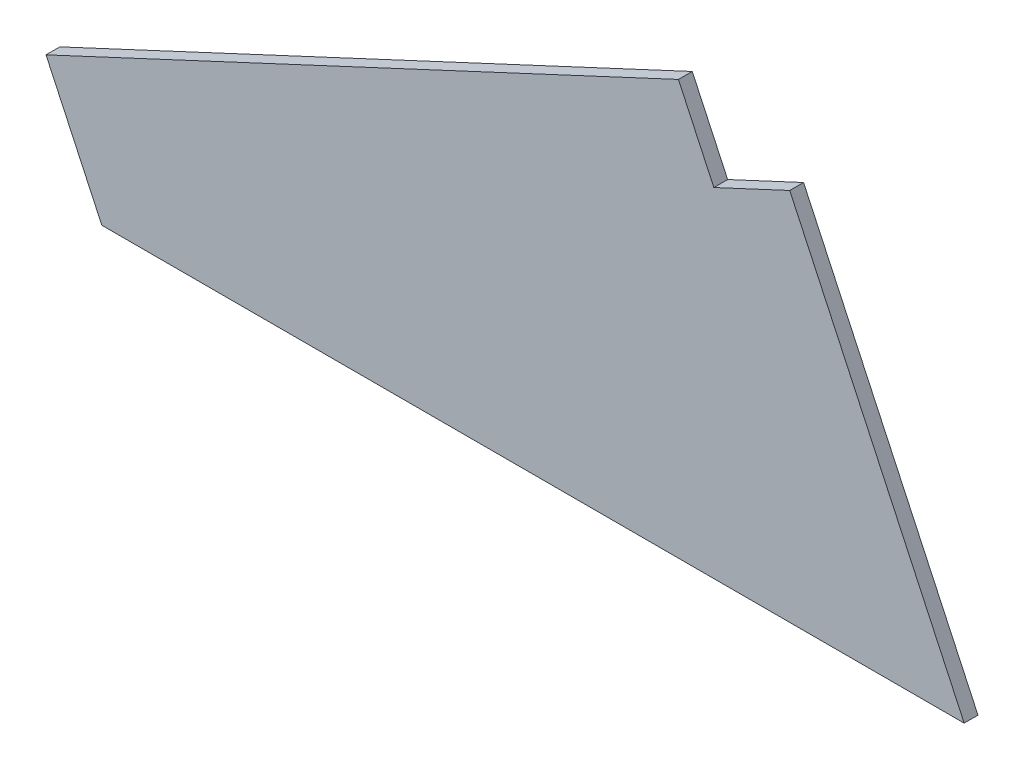
ISO-10303-21;
HEADER;
FILE_DESCRIPTION(('STEP AP214'),'2;1');
FILE_NAME('part.step','',(''),(''),'','','');
FILE_SCHEMA(('AUTOMOTIVE_DESIGN { 1 0 10303 214 1 1 1 1 }'));
ENDSEC;
DATA;
#1=APPLICATION_CONTEXT('core data for automotive mechanical design processes');
#2=APPLICATION_PROTOCOL_DEFINITION('international standard','automotive_design',2000,#1);
#3=PRODUCT_CONTEXT('',#1,'mechanical');
#4=PRODUCT('Part','Part','',(#3));
#5=PRODUCT_RELATED_PRODUCT_CATEGORY('part','',(#4));
#6=PRODUCT_DEFINITION_FORMATION('','',#4);
#7=PRODUCT_DEFINITION_CONTEXT('part definition',#1,'design');
#8=PRODUCT_DEFINITION('design','',#6,#7);
#9=PRODUCT_DEFINITION_SHAPE('','',#8);
#10=(LENGTH_UNIT() NAMED_UNIT(*) SI_UNIT(.MILLI.,.METRE.));
#11=(NAMED_UNIT(*) PLANE_ANGLE_UNIT() SI_UNIT($,.RADIAN.));
#12=(NAMED_UNIT(*) SI_UNIT($,.STERADIAN.) SOLID_ANGLE_UNIT());
#13=UNCERTAINTY_MEASURE_WITH_UNIT(LENGTH_MEASURE(1.E-05),#10,'distance_accuracy_value','');
#14=(GEOMETRIC_REPRESENTATION_CONTEXT(3) GLOBAL_UNCERTAINTY_ASSIGNED_CONTEXT((#13)) GLOBAL_UNIT_ASSIGNED_CONTEXT((#10,
#11,#12)) REPRESENTATION_CONTEXT('',''));
#15=CARTESIAN_POINT('',(0.,0.,0.));
#16=DIRECTION('',(0.,0.,1.));
#17=DIRECTION('',(1.,0.,0.));
#18=AXIS2_PLACEMENT_3D('',#15,#16,#17);
#19=CARTESIAN_POINT('',(285.777429853148,89.3410252685155,-3.3));
#20=DIRECTION('',(0.906307787036651,0.422618261740697,0.));
#21=DIRECTION('',(-0.422618261740697,0.906307787036651,0.));
#22=AXIS2_PLACEMENT_3D('',#19,#20,#21);
#23=PLANE('',#22);
#24=DIRECTION('',(-0.422618261740697,0.906307787036651,0.));
#25=VECTOR('',#24,1.);
#26=CARTESIAN_POINT('',(285.777429853148,89.3410252685155,0.));
#27=LINE('',#26,#25);
#28=CARTESIAN_POINT('',(327.436217585211,0.00346667706754027,0.));
#29=VERTEX_POINT('',#28);
#30=CARTESIAN_POINT('',(285.777429853148,89.3410252685155,0.));
#31=VERTEX_POINT('',#30);
#32=EDGE_CURVE('E119',#29,#31,#27,.T.);
#33=ORIENTED_EDGE('',*,*,#32,.F.);
#34=DIRECTION('',(0.,0.,1.));
#35=VECTOR('',#34,1.);
#36=CARTESIAN_POINT('',(327.436217585211,0.00346667706754027,-3.3));
#37=LINE('',#36,#35);
#38=CARTESIAN_POINT('',(327.436217585211,0.00346667706754027,-3.3));
#39=VERTEX_POINT('',#38);
#40=EDGE_CURVE('E11',#39,#29,#37,.T.);
#41=ORIENTED_EDGE('',*,*,#40,.F.);
#42=DIRECTION('',(-0.422618261740697,0.906307787036651,0.));
#43=VECTOR('',#42,1.);
#44=CARTESIAN_POINT('',(285.777429853148,89.3410252685155,-3.3));
#45=LINE('',#44,#43);
#46=CARTESIAN_POINT('',(285.777429853148,89.3410252685155,-3.3));
#47=VERTEX_POINT('',#46);
#48=EDGE_CURVE('E133',#39,#47,#45,.T.);
#49=ORIENTED_EDGE('',*,*,#48,.T.);
#50=DIRECTION('',(0.,0.,1.));
#51=VECTOR('',#50,1.);
#52=CARTESIAN_POINT('',(285.777429853148,89.3410252685155,-3.3));
#53=LINE('',#52,#51);
#54=EDGE_CURVE('E37',#47,#31,#53,.T.);
#55=ORIENTED_EDGE('',*,*,#54,.T.);
#56=EDGE_LOOP('',(#33,#41,#49,#55));
#57=FACE_BOUND('',#56,.T.);
#58=ADVANCED_FACE('F34',(#57),#23,.T.);
#59=CARTESIAN_POINT('',(327.436217585211,0.00346667706754027,-3.3));
#60=DIRECTION('',(0.,-1.,0.));
#61=DIRECTION('',(1.,0.,0.));
#62=AXIS2_PLACEMENT_3D('',#59,#60,#61);
#63=PLANE('',#62);
#64=DIRECTION('',(1.,0.,0.));
#65=VECTOR('',#64,1.);
#66=CARTESIAN_POINT('',(327.436217585211,0.00346667706754027,0.));
#67=LINE('',#66,#65);
#68=CARTESIAN_POINT('',(121.49838346194,0.00346667706751505,0.));
#69=VERTEX_POINT('',#68);
#70=EDGE_CURVE('E131',#69,#29,#67,.T.);
#71=ORIENTED_EDGE('',*,*,#70,.F.);
#72=DIRECTION('',(0.,0.,1.));
#73=VECTOR('',#72,1.);
#74=CARTESIAN_POINT('',(121.49838346194,0.00346667706751505,-3.3));
#75=LINE('',#74,#73);
#76=CARTESIAN_POINT('',(121.49838346194,0.00346667706751505,-3.3));
#77=VERTEX_POINT('',#76);
#78=EDGE_CURVE('E43',#77,#69,#75,.T.);
#79=ORIENTED_EDGE('',*,*,#78,.F.);
#80=DIRECTION('',(1.,0.,0.));
#81=VECTOR('',#80,1.);
#82=CARTESIAN_POINT('',(327.436217585211,0.00346667706754027,-3.3));
#83=LINE('',#82,#81);
#84=EDGE_CURVE('E109',#77,#39,#83,.T.);
#85=ORIENTED_EDGE('',*,*,#84,.T.);
#86=ORIENTED_EDGE('',*,*,#40,.T.);
#87=EDGE_LOOP('',(#71,#79,#85,#86));
#88=FACE_BOUND('',#87,.T.);
#89=ADVANCED_FACE('F141',(#88),#63,.T.);
#90=CARTESIAN_POINT('',(121.49838346194,0.00346667706751505,-3.3));
#91=DIRECTION('',(-0.906307787036652,-0.422618261740696,0.));
#92=DIRECTION('',(0.422618261740696,-0.906307787036652,0.));
#93=AXIS2_PLACEMENT_3D('',#90,#91,#92);
#94=PLANE('',#93);
#95=DIRECTION('',(0.422618261740695,-0.906307787036652,0.));
#96=VECTOR('',#95,1.);
#97=CARTESIAN_POINT('',(121.49838346194,0.00346667706751505,0.));
#98=LINE('',#97,#96);
#99=CARTESIAN_POINT('',(108.169003486638,28.5884142802035,0.));
#100=VERTEX_POINT('',#99);
#101=EDGE_CURVE('E96',#100,#69,#98,.T.);
#102=ORIENTED_EDGE('',*,*,#101,.F.);
#103=DIRECTION('',(0.,0.,1.));
#104=VECTOR('',#103,1.);
#105=CARTESIAN_POINT('',(108.169003486638,28.5884142802035,-3.3));
#106=LINE('',#105,#104);
#107=CARTESIAN_POINT('',(108.169003486638,28.5884142802035,-3.3));
#108=VERTEX_POINT('',#107);
#109=EDGE_CURVE('E91',#108,#100,#106,.T.);
#110=ORIENTED_EDGE('',*,*,#109,.F.);
#111=DIRECTION('',(0.422618261740695,-0.906307787036652,0.));
#112=VECTOR('',#111,1.);
#113=CARTESIAN_POINT('',(121.49838346194,0.00346667706751505,-3.3));
#114=LINE('',#113,#112);
#115=EDGE_CURVE('E94',#108,#77,#114,.T.);
#116=ORIENTED_EDGE('',*,*,#115,.T.);
#117=ORIENTED_EDGE('',*,*,#78,.T.);
#118=EDGE_LOOP('',(#102,#110,#116,#117));
#119=FACE_BOUND('',#118,.T.);
#120=ADVANCED_FACE('F93',(#119),#94,.T.);
#121=CARTESIAN_POINT('',(108.169003486638,28.5884142802035,-3.3));
#122=DIRECTION('',(-0.4226182617407,0.90630778703665,0.));
#123=DIRECTION('',(-0.90630778703665,-0.4226182617407,0.));
#124=AXIS2_PLACEMENT_3D('',#121,#122,#123);
#125=PLANE('',#124);
#126=DIRECTION('',(-0.906307787036649,-0.4226182617407,0.));
#127=VECTOR('',#126,1.);
#128=CARTESIAN_POINT('',(108.169003486638,28.5884142802035,0.));
#129=LINE('',#128,#127);
#130=CARTESIAN_POINT('',(259.198908877601,99.0148157744347,0.));
#131=VERTEX_POINT('',#130);
#132=EDGE_CURVE('E128',#131,#100,#129,.T.);
#133=ORIENTED_EDGE('',*,*,#132,.F.);
#134=DIRECTION('',(0.,0.,1.));
#135=VECTOR('',#134,1.);
#136=CARTESIAN_POINT('',(259.198908877601,99.0148157744347,-3.3));
#137=LINE('',#136,#135);
#138=CARTESIAN_POINT('',(259.198908877601,99.0148157744347,-3.3));
#139=VERTEX_POINT('',#138);
#140=EDGE_CURVE('E101',#139,#131,#137,.T.);
#141=ORIENTED_EDGE('',*,*,#140,.F.);
#142=DIRECTION('',(-0.906307787036649,-0.4226182617407,0.));
#143=VECTOR('',#142,1.);
#144=CARTESIAN_POINT('',(108.169003486638,28.5884142802035,-3.3));
#145=LINE('',#144,#143);
#146=EDGE_CURVE('E107',#139,#108,#145,.T.);
#147=ORIENTED_EDGE('',*,*,#146,.T.);
#148=ORIENTED_EDGE('',*,*,#109,.T.);
#149=EDGE_LOOP('',(#133,#141,#147,#148));
#150=FACE_BOUND('',#149,.T.);
#151=ADVANCED_FACE('F111',(#150),#125,.T.);
#152=CARTESIAN_POINT('',(259.198908877601,99.0148157744347,-3.3));
#153=DIRECTION('',(0.906307787036652,0.422618261740695,0.));
#154=DIRECTION('',(-0.422618261740696,0.906307787036652,0.));
#155=AXIS2_PLACEMENT_3D('',#152,#153,#154);
#156=PLANE('',#155);
#157=DIRECTION('',(-0.422618261740696,0.906307787036652,0.));
#158=VECTOR('',#157,1.);
#159=CARTESIAN_POINT('',(259.198908877601,99.0148157744347,0.));
#160=LINE('',#159,#158);
#161=CARTESIAN_POINT('',(267.651274112415,80.8886600337016,0.));
#162=VERTEX_POINT('',#161);
#163=EDGE_CURVE('E125',#162,#131,#160,.T.);
#164=ORIENTED_EDGE('',*,*,#163,.F.);
#165=DIRECTION('',(0.,0.,1.));
#166=VECTOR('',#165,1.);
#167=CARTESIAN_POINT('',(267.651274112415,80.8886600337016,-3.3));
#168=LINE('',#167,#166);
#169=CARTESIAN_POINT('',(267.651274112415,80.8886600337016,-3.3));
#170=VERTEX_POINT('',#169);
#171=EDGE_CURVE('E136',#170,#162,#168,.T.);
#172=ORIENTED_EDGE('',*,*,#171,.F.);
#173=DIRECTION('',(-0.422618261740696,0.906307787036652,0.));
#174=VECTOR('',#173,1.);
#175=CARTESIAN_POINT('',(259.198908877601,99.0148157744347,-3.3));
#176=LINE('',#175,#174);
#177=EDGE_CURVE('E112',#170,#139,#176,.T.);
#178=ORIENTED_EDGE('',*,*,#177,.T.);
#179=ORIENTED_EDGE('',*,*,#140,.T.);
#180=EDGE_LOOP('',(#164,#172,#178,#179));
#181=FACE_BOUND('',#180,.T.);
#182=ADVANCED_FACE('F154',(#181),#156,.T.);
#183=CARTESIAN_POINT('',(267.651274112415,80.8886600337016,-3.3));
#184=DIRECTION('',(-0.422618261740698,0.906307787036651,0.));
#185=DIRECTION('',(-0.906307787036651,-0.422618261740698,0.));
#186=AXIS2_PLACEMENT_3D('',#183,#184,#185);
#187=PLANE('',#186);
#188=DIRECTION('',(-0.906307787036651,-0.422618261740698,0.));
#189=VECTOR('',#188,1.);
#190=CARTESIAN_POINT('',(267.651274112415,80.8886600337016,0.));
#191=LINE('',#190,#189);
#192=EDGE_CURVE('E122',#31,#162,#191,.T.);
#193=ORIENTED_EDGE('',*,*,#192,.F.);
#194=ORIENTED_EDGE('',*,*,#54,.F.);
#195=DIRECTION('',(-0.906307787036651,-0.422618261740698,0.));
#196=VECTOR('',#195,1.);
#197=CARTESIAN_POINT('',(267.651274112415,80.8886600337016,-3.3));
#198=LINE('',#197,#196);
#199=EDGE_CURVE('E114',#47,#170,#198,.T.);
#200=ORIENTED_EDGE('',*,*,#199,.T.);
#201=ORIENTED_EDGE('',*,*,#171,.T.);
#202=EDGE_LOOP('',(#193,#194,#200,#201));
#203=FACE_BOUND('',#202,.T.);
#204=ADVANCED_FACE('F138',(#203),#187,.T.);
#205=CARTESIAN_POINT('',(0.,0.,-3.3));
#206=DIRECTION('',(0.,0.,1.));
#207=DIRECTION('',(1.,0.,0.));
#208=AXIS2_PLACEMENT_3D('',#205,#206,#207);
#209=PLANE('',#208);
#210=ORIENTED_EDGE('',*,*,#48,.F.);
#211=ORIENTED_EDGE('',*,*,#84,.F.);
#212=ORIENTED_EDGE('',*,*,#115,.F.);
#213=ORIENTED_EDGE('',*,*,#146,.F.);
#214=ORIENTED_EDGE('',*,*,#177,.F.);
#215=ORIENTED_EDGE('',*,*,#199,.F.);
#216=EDGE_LOOP('',(#210,#211,#212,#213,#214,#215));
#217=FACE_BOUND('',#216,.T.);
#218=ADVANCED_FACE('F105',(#217),#209,.F.);
#219=CARTESIAN_POINT('',(0.,0.,0.));
#220=DIRECTION('',(0.,0.,1.));
#221=DIRECTION('',(1.,0.,0.));
#222=AXIS2_PLACEMENT_3D('',#219,#220,#221);
#223=PLANE('',#222);
#224=ORIENTED_EDGE('',*,*,#32,.T.);
#225=ORIENTED_EDGE('',*,*,#192,.T.);
#226=ORIENTED_EDGE('',*,*,#163,.T.);
#227=ORIENTED_EDGE('',*,*,#132,.T.);
#228=ORIENTED_EDGE('',*,*,#101,.T.);
#229=ORIENTED_EDGE('',*,*,#70,.T.);
#230=EDGE_LOOP('',(#224,#225,#226,#227,#228,#229));
#231=FACE_BOUND('',#230,.T.);
#232=ADVANCED_FACE('F140',(#231),#223,.T.);
#233=CLOSED_SHELL('',(#58,#89,#120,#151,#182,#204,#218,#232));
#234=MANIFOLD_SOLID_BREP('B2',#233);
#235=ADVANCED_BREP_SHAPE_REPRESENTATION('',(#18,#234),#14);
#236=SHAPE_DEFINITION_REPRESENTATION(#9,#235);
ENDSEC;
END-ISO-10303-21;
